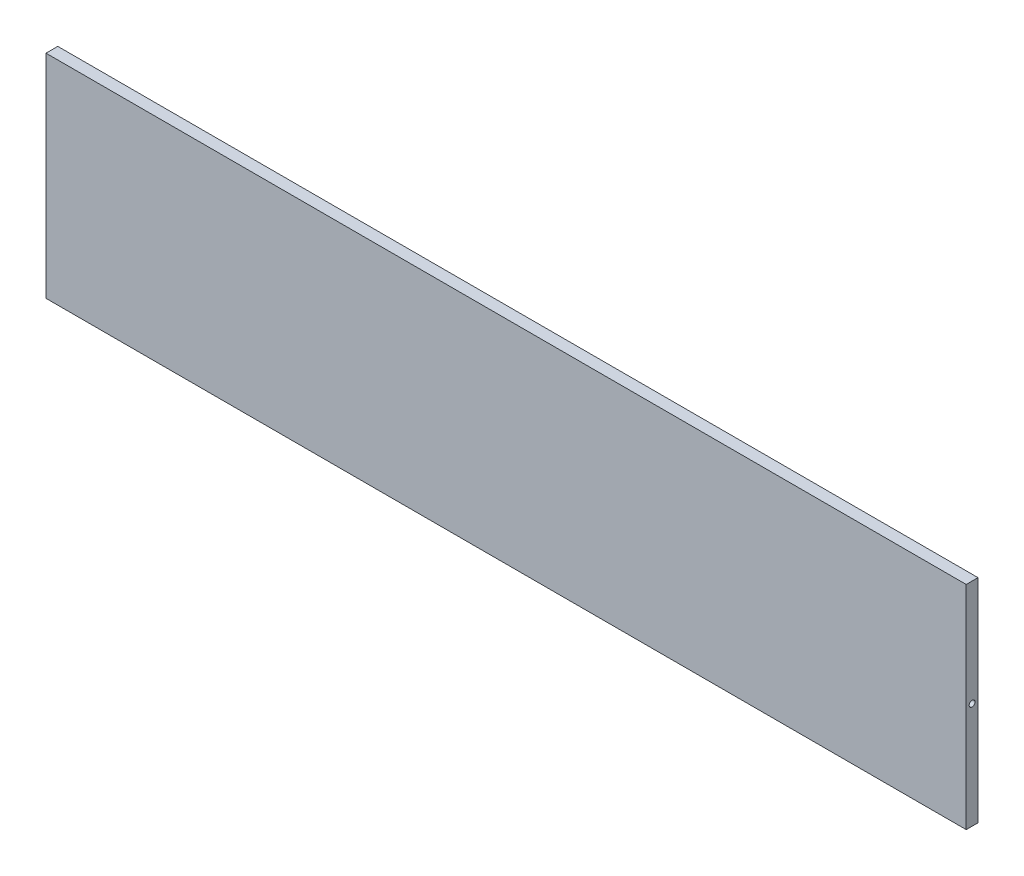
ISO-10303-21;
HEADER;
FILE_DESCRIPTION(('STEP AP214'),'2;1');
FILE_NAME('part.step','',(''),(''),'','','');
FILE_SCHEMA(('AUTOMOTIVE_DESIGN { 1 0 10303 214 1 1 1 1 }'));
ENDSEC;
DATA;
#1=APPLICATION_CONTEXT('core data for automotive mechanical design processes');
#2=APPLICATION_PROTOCOL_DEFINITION('international standard','automotive_design',2000,#1);
#3=PRODUCT_CONTEXT('',#1,'mechanical');
#4=PRODUCT('Part','Part','',(#3));
#5=PRODUCT_RELATED_PRODUCT_CATEGORY('part','',(#4));
#6=PRODUCT_DEFINITION_FORMATION('','',#4);
#7=PRODUCT_DEFINITION_CONTEXT('part definition',#1,'design');
#8=PRODUCT_DEFINITION('design','',#6,#7);
#9=PRODUCT_DEFINITION_SHAPE('','',#8);
#10=(LENGTH_UNIT() NAMED_UNIT(*) SI_UNIT(.MILLI.,.METRE.));
#11=(NAMED_UNIT(*) PLANE_ANGLE_UNIT() SI_UNIT($,.RADIAN.));
#12=(NAMED_UNIT(*) SI_UNIT($,.STERADIAN.) SOLID_ANGLE_UNIT());
#13=UNCERTAINTY_MEASURE_WITH_UNIT(LENGTH_MEASURE(1.E-05),#10,'distance_accuracy_value','');
#14=(GEOMETRIC_REPRESENTATION_CONTEXT(3) GLOBAL_UNCERTAINTY_ASSIGNED_CONTEXT((#13)) GLOBAL_UNIT_ASSIGNED_CONTEXT((#10,
#11,#12)) REPRESENTATION_CONTEXT('',''));
#15=CARTESIAN_POINT('',(0.,0.,0.));
#16=DIRECTION('',(0.,0.,1.));
#17=DIRECTION('',(1.,0.,0.));
#18=AXIS2_PLACEMENT_3D('',#15,#16,#17);
#19=CARTESIAN_POINT('',(0.,0.,5.));
#20=DIRECTION('',(1.,0.,0.));
#21=DIRECTION('',(0.,0.,-1.));
#22=AXIS2_PLACEMENT_3D('',#19,#20,#21);
#23=PLANE('',#22);
#24=CARTESIAN_POINT('',(0.,45.,2.5));
#25=DIRECTION('',(-1.,0.,0.));
#26=DIRECTION('',(0.,0.,1.));
#27=AXIS2_PLACEMENT_3D('',#24,#25,#26);
#28=CIRCLE('',#27,1.25);
#29=CARTESIAN_POINT('',(0.,45.,3.75));
#30=VERTEX_POINT('',#29);
#31=EDGE_CURVE('E128',#30,#30,#28,.T.);
#32=ORIENTED_EDGE('',*,*,#31,.F.);
#33=EDGE_LOOP('',(#32));
#34=FACE_BOUND('',#33,.T.);
#35=DIRECTION('',(0.,-1.,0.));
#36=VECTOR('',#35,1.);
#37=CARTESIAN_POINT('',(0.,0.,0.));
#38=LINE('',#37,#36);
#39=CARTESIAN_POINT('',(0.,90.,0.));
#40=VERTEX_POINT('',#39);
#41=CARTESIAN_POINT('',(0.,0.,0.));
#42=VERTEX_POINT('',#41);
#43=EDGE_CURVE('E107',#40,#42,#38,.T.);
#44=ORIENTED_EDGE('',*,*,#43,.T.);
#45=DIRECTION('',(0.,0.,-1.));
#46=VECTOR('',#45,1.);
#47=CARTESIAN_POINT('',(0.,0.,5.));
#48=LINE('',#47,#46);
#49=CARTESIAN_POINT('',(0.,0.,5.));
#50=VERTEX_POINT('',#49);
#51=EDGE_CURVE('E11',#50,#42,#48,.T.);
#52=ORIENTED_EDGE('',*,*,#51,.F.);
#53=DIRECTION('',(0.,-1.,0.));
#54=VECTOR('',#53,1.);
#55=CARTESIAN_POINT('',(0.,0.,5.));
#56=LINE('',#55,#54);
#57=CARTESIAN_POINT('',(0.,90.,5.));
#58=VERTEX_POINT('',#57);
#59=EDGE_CURVE('E91',#58,#50,#56,.T.);
#60=ORIENTED_EDGE('',*,*,#59,.F.);
#61=DIRECTION('',(0.,0.,-1.));
#62=VECTOR('',#61,1.);
#63=CARTESIAN_POINT('',(0.,90.,5.));
#64=LINE('',#63,#62);
#65=EDGE_CURVE('E103',#58,#40,#64,.T.);
#66=ORIENTED_EDGE('',*,*,#65,.T.);
#67=EDGE_LOOP('',(#44,#52,#60,#66));
#68=FACE_BOUND('',#67,.T.);
#69=ADVANCED_FACE('F39',(#34,#68),#23,.F.);
#70=CARTESIAN_POINT('',(0.,0.,5.));
#71=DIRECTION('',(0.,1.,0.));
#72=DIRECTION('',(0.,0.,1.));
#73=AXIS2_PLACEMENT_3D('',#70,#71,#72);
#74=PLANE('',#73);
#75=CARTESIAN_POINT('',(35.,0.,2.5));
#76=DIRECTION('',(0.,-1.,0.));
#77=DIRECTION('',(0.,0.,-1.));
#78=AXIS2_PLACEMENT_3D('',#75,#76,#77);
#79=CIRCLE('',#78,1.25000000000001);
#80=CARTESIAN_POINT('',(35.,0.,1.25));
#81=VERTEX_POINT('',#80);
#82=EDGE_CURVE('E145',#81,#81,#79,.T.);
#83=ORIENTED_EDGE('',*,*,#82,.F.);
#84=EDGE_LOOP('',(#83));
#85=FACE_BOUND('',#84,.T.);
#86=CARTESIAN_POINT('',(355.,0.,2.5));
#87=DIRECTION('',(0.,-1.,0.));
#88=DIRECTION('',(0.,0.,-1.));
#89=AXIS2_PLACEMENT_3D('',#86,#87,#88);
#90=CIRCLE('',#89,1.24999999999996);
#91=CARTESIAN_POINT('',(355.,0.,1.25000000000004));
#92=VERTEX_POINT('',#91);
#93=EDGE_CURVE('E136',#92,#92,#90,.T.);
#94=ORIENTED_EDGE('',*,*,#93,.F.);
#95=EDGE_LOOP('',(#94));
#96=FACE_BOUND('',#95,.T.);
#97=DIRECTION('',(1.,0.,0.));
#98=VECTOR('',#97,1.);
#99=CARTESIAN_POINT('',(0.,0.,0.));
#100=LINE('',#99,#98);
#101=CARTESIAN_POINT('',(390.,0.,0.));
#102=VERTEX_POINT('',#101);
#103=EDGE_CURVE('E96',#42,#102,#100,.T.);
#104=ORIENTED_EDGE('',*,*,#103,.T.);
#105=DIRECTION('',(0.,0.,-1.));
#106=VECTOR('',#105,1.);
#107=CARTESIAN_POINT('',(390.,0.,5.));
#108=LINE('',#107,#106);
#109=CARTESIAN_POINT('',(390.,0.,5.));
#110=VERTEX_POINT('',#109);
#111=EDGE_CURVE('E48',#110,#102,#108,.T.);
#112=ORIENTED_EDGE('',*,*,#111,.F.);
#113=DIRECTION('',(1.,0.,0.));
#114=VECTOR('',#113,1.);
#115=CARTESIAN_POINT('',(0.,0.,5.));
#116=LINE('',#115,#114);
#117=EDGE_CURVE('E86',#50,#110,#116,.T.);
#118=ORIENTED_EDGE('',*,*,#117,.F.);
#119=ORIENTED_EDGE('',*,*,#51,.T.);
#120=EDGE_LOOP('',(#104,#112,#118,#119));
#121=FACE_BOUND('',#120,.T.);
#122=ADVANCED_FACE('F95',(#85,#96,#121),#74,.F.);
#123=CARTESIAN_POINT('',(390.,0.,5.));
#124=DIRECTION('',(-1.,0.,0.));
#125=DIRECTION('',(0.,0.,1.));
#126=AXIS2_PLACEMENT_3D('',#123,#124,#125);
#127=PLANE('',#126);
#128=CARTESIAN_POINT('',(390.,45.,2.5));
#129=DIRECTION('',(1.,0.,0.));
#130=DIRECTION('',(0.,0.,-1.));
#131=AXIS2_PLACEMENT_3D('',#128,#129,#130);
#132=CIRCLE('',#131,1.25);
#133=CARTESIAN_POINT('',(390.,45.,1.25));
#134=VERTEX_POINT('',#133);
#135=EDGE_CURVE('E152',#134,#134,#132,.T.);
#136=ORIENTED_EDGE('',*,*,#135,.F.);
#137=EDGE_LOOP('',(#136));
#138=FACE_BOUND('',#137,.T.);
#139=DIRECTION('',(0.,1.,0.));
#140=VECTOR('',#139,1.);
#141=CARTESIAN_POINT('',(390.,0.,0.));
#142=LINE('',#141,#140);
#143=CARTESIAN_POINT('',(390.,90.,0.));
#144=VERTEX_POINT('',#143);
#145=EDGE_CURVE('E73',#102,#144,#142,.T.);
#146=ORIENTED_EDGE('',*,*,#145,.T.);
#147=DIRECTION('',(0.,0.,-1.));
#148=VECTOR('',#147,1.);
#149=CARTESIAN_POINT('',(390.,90.,5.));
#150=LINE('',#149,#148);
#151=CARTESIAN_POINT('',(390.,90.,5.));
#152=VERTEX_POINT('',#151);
#153=EDGE_CURVE('E98',#152,#144,#150,.T.);
#154=ORIENTED_EDGE('',*,*,#153,.F.);
#155=DIRECTION('',(0.,1.,0.));
#156=VECTOR('',#155,1.);
#157=CARTESIAN_POINT('',(390.,0.,5.));
#158=LINE('',#157,#156);
#159=EDGE_CURVE('E89',#110,#152,#158,.T.);
#160=ORIENTED_EDGE('',*,*,#159,.F.);
#161=ORIENTED_EDGE('',*,*,#111,.T.);
#162=EDGE_LOOP('',(#146,#154,#160,#161));
#163=FACE_BOUND('',#162,.T.);
#164=ADVANCED_FACE('F99',(#138,#163),#127,.F.);
#165=CARTESIAN_POINT('',(0.,90.,5.));
#166=DIRECTION('',(0.,-1.,0.));
#167=DIRECTION('',(0.,0.,-1.));
#168=AXIS2_PLACEMENT_3D('',#165,#166,#167);
#169=PLANE('',#168);
#170=DIRECTION('',(-1.,0.,0.));
#171=VECTOR('',#170,1.);
#172=CARTESIAN_POINT('',(0.,90.,0.));
#173=LINE('',#172,#171);
#174=EDGE_CURVE('E79',#144,#40,#173,.T.);
#175=ORIENTED_EDGE('',*,*,#174,.T.);
#176=ORIENTED_EDGE('',*,*,#65,.F.);
#177=DIRECTION('',(-1.,0.,0.));
#178=VECTOR('',#177,1.);
#179=CARTESIAN_POINT('',(0.,90.,5.));
#180=LINE('',#179,#178);
#181=EDGE_CURVE('E56',#152,#58,#180,.T.);
#182=ORIENTED_EDGE('',*,*,#181,.F.);
#183=ORIENTED_EDGE('',*,*,#153,.T.);
#184=EDGE_LOOP('',(#175,#176,#182,#183));
#185=FACE_BOUND('',#184,.T.);
#186=ADVANCED_FACE('F121',(#185),#169,.F.);
#187=CARTESIAN_POINT('',(0.,0.,5.));
#188=DIRECTION('',(0.,0.,-1.));
#189=DIRECTION('',(-1.,0.,0.));
#190=AXIS2_PLACEMENT_3D('',#187,#188,#189);
#191=PLANE('',#190);
#192=ORIENTED_EDGE('',*,*,#59,.T.);
#193=ORIENTED_EDGE('',*,*,#117,.T.);
#194=ORIENTED_EDGE('',*,*,#159,.T.);
#195=ORIENTED_EDGE('',*,*,#181,.T.);
#196=EDGE_LOOP('',(#192,#193,#194,#195));
#197=FACE_BOUND('',#196,.T.);
#198=ADVANCED_FACE('F87',(#197),#191,.F.);
#199=CARTESIAN_POINT('',(0.,0.,0.));
#200=DIRECTION('',(0.,0.,-1.));
#201=DIRECTION('',(-1.,0.,0.));
#202=AXIS2_PLACEMENT_3D('',#199,#200,#201);
#203=PLANE('',#202);
#204=ORIENTED_EDGE('',*,*,#43,.F.);
#205=ORIENTED_EDGE('',*,*,#174,.F.);
#206=ORIENTED_EDGE('',*,*,#145,.F.);
#207=ORIENTED_EDGE('',*,*,#103,.F.);
#208=EDGE_LOOP('',(#204,#205,#206,#207));
#209=FACE_BOUND('',#208,.T.);
#210=ADVANCED_FACE('F124',(#209),#203,.T.);
#211=CARTESIAN_POINT('',(15.,45.,2.5));
#212=DIRECTION('',(-1.,0.,0.));
#213=DIRECTION('',(0.,0.,1.));
#214=AXIS2_PLACEMENT_3D('',#211,#212,#213);
#215=CYLINDRICAL_SURFACE('',#214,1.25);
#216=CARTESIAN_POINT('',(15.,45.,2.5));
#217=DIRECTION('',(-1.,0.,0.));
#218=DIRECTION('',(0.,0.,1.));
#219=AXIS2_PLACEMENT_3D('',#216,#217,#218);
#220=CIRCLE('',#219,1.25);
#221=CARTESIAN_POINT('',(15.,45.,3.75));
#222=VERTEX_POINT('',#221);
#223=EDGE_CURVE('E111',#222,#222,#220,.T.);
#224=ORIENTED_EDGE('',*,*,#223,.F.);
#225=EDGE_LOOP('',(#224));
#226=FACE_BOUND('',#225,.T.);
#227=ORIENTED_EDGE('',*,*,#31,.T.);
#228=EDGE_LOOP('',(#227));
#229=FACE_BOUND('',#228,.T.);
#230=ADVANCED_FACE('F183',(#226,#229),#215,.F.);
#231=CARTESIAN_POINT('',(15.,45.,2.5));
#232=DIRECTION('',(-1.,0.,0.));
#233=DIRECTION('',(0.,0.,1.));
#234=AXIS2_PLACEMENT_3D('',#231,#232,#233);
#235=PLANE('',#234);
#236=ORIENTED_EDGE('',*,*,#223,.T.);
#237=EDGE_LOOP('',(#236));
#238=FACE_BOUND('',#237,.T.);
#239=ADVANCED_FACE('F185',(#238),#235,.T.);
#240=CARTESIAN_POINT('',(355.,15.,2.5));
#241=DIRECTION('',(0.,-1.,0.));
#242=DIRECTION('',(0.,0.,-1.));
#243=AXIS2_PLACEMENT_3D('',#240,#241,#242);
#244=CYLINDRICAL_SURFACE('',#243,1.24999999999996);
#245=CARTESIAN_POINT('',(355.,15.,2.5));
#246=DIRECTION('',(0.,-1.,0.));
#247=DIRECTION('',(0.,0.,-1.));
#248=AXIS2_PLACEMENT_3D('',#245,#246,#247);
#249=CIRCLE('',#248,1.24999999999996);
#250=CARTESIAN_POINT('',(355.,15.,1.25000000000004));
#251=VERTEX_POINT('',#250);
#252=EDGE_CURVE('E140',#251,#251,#249,.T.);
#253=ORIENTED_EDGE('',*,*,#252,.F.);
#254=EDGE_LOOP('',(#253));
#255=FACE_BOUND('',#254,.T.);
#256=ORIENTED_EDGE('',*,*,#93,.T.);
#257=EDGE_LOOP('',(#256));
#258=FACE_BOUND('',#257,.T.);
#259=ADVANCED_FACE('F192',(#255,#258),#244,.F.);
#260=CARTESIAN_POINT('',(355.,15.,2.5));
#261=DIRECTION('',(0.,-1.,0.));
#262=DIRECTION('',(0.,0.,-1.));
#263=AXIS2_PLACEMENT_3D('',#260,#261,#262);
#264=PLANE('',#263);
#265=ORIENTED_EDGE('',*,*,#252,.T.);
#266=EDGE_LOOP('',(#265));
#267=FACE_BOUND('',#266,.T.);
#268=ADVANCED_FACE('F238',(#267),#264,.T.);
#269=CARTESIAN_POINT('',(35.,15.,2.5));
#270=DIRECTION('',(0.,-1.,0.));
#271=DIRECTION('',(0.,0.,-1.));
#272=AXIS2_PLACEMENT_3D('',#269,#270,#271);
#273=CYLINDRICAL_SURFACE('',#272,1.25000000000001);
#274=CARTESIAN_POINT('',(35.,15.,2.5));
#275=DIRECTION('',(0.,-1.,0.));
#276=DIRECTION('',(0.,0.,-1.));
#277=AXIS2_PLACEMENT_3D('',#274,#275,#276);
#278=CIRCLE('',#277,1.25000000000001);
#279=CARTESIAN_POINT('',(35.,15.,1.25));
#280=VERTEX_POINT('',#279);
#281=EDGE_CURVE('E132',#280,#280,#278,.T.);
#282=ORIENTED_EDGE('',*,*,#281,.F.);
#283=EDGE_LOOP('',(#282));
#284=FACE_BOUND('',#283,.T.);
#285=ORIENTED_EDGE('',*,*,#82,.T.);
#286=EDGE_LOOP('',(#285));
#287=FACE_BOUND('',#286,.T.);
#288=ADVANCED_FACE('F247',(#284,#287),#273,.F.);
#289=CARTESIAN_POINT('',(35.,15.,2.5));
#290=DIRECTION('',(0.,-1.,0.));
#291=DIRECTION('',(0.,0.,-1.));
#292=AXIS2_PLACEMENT_3D('',#289,#290,#291);
#293=PLANE('',#292);
#294=ORIENTED_EDGE('',*,*,#281,.T.);
#295=EDGE_LOOP('',(#294));
#296=FACE_BOUND('',#295,.T.);
#297=ADVANCED_FACE('F165',(#296),#293,.T.);
#298=CARTESIAN_POINT('',(375.,45.,2.5));
#299=DIRECTION('',(1.,0.,0.));
#300=DIRECTION('',(0.,0.,-1.));
#301=AXIS2_PLACEMENT_3D('',#298,#299,#300);
#302=CYLINDRICAL_SURFACE('',#301,1.25);
#303=CARTESIAN_POINT('',(375.,45.,2.5));
#304=DIRECTION('',(1.,0.,0.));
#305=DIRECTION('',(0.,0.,-1.));
#306=AXIS2_PLACEMENT_3D('',#303,#304,#305);
#307=CIRCLE('',#306,1.25);
#308=CARTESIAN_POINT('',(375.,45.,1.25));
#309=VERTEX_POINT('',#308);
#310=EDGE_CURVE('E141',#309,#309,#307,.T.);
#311=ORIENTED_EDGE('',*,*,#310,.F.);
#312=EDGE_LOOP('',(#311));
#313=FACE_BOUND('',#312,.T.);
#314=ORIENTED_EDGE('',*,*,#135,.T.);
#315=EDGE_LOOP('',(#314));
#316=FACE_BOUND('',#315,.T.);
#317=ADVANCED_FACE('F162',(#313,#316),#302,.F.);
#318=CARTESIAN_POINT('',(375.,45.,2.5));
#319=DIRECTION('',(1.,0.,0.));
#320=DIRECTION('',(0.,0.,-1.));
#321=AXIS2_PLACEMENT_3D('',#318,#319,#320);
#322=PLANE('',#321);
#323=ORIENTED_EDGE('',*,*,#310,.T.);
#324=EDGE_LOOP('',(#323));
#325=FACE_BOUND('',#324,.T.);
#326=ADVANCED_FACE('F160',(#325),#322,.T.);
#327=CLOSED_SHELL('',(#69,#122,#164,#186,#198,#210,#230,#239,#259,#268,#288,#297,#317,#326));
#328=MANIFOLD_SOLID_BREP('B2',#327);
#329=ADVANCED_BREP_SHAPE_REPRESENTATION('',(#18,#328),#14);
#330=SHAPE_DEFINITION_REPRESENTATION(#9,#329);
ENDSEC;
END-ISO-10303-21;
